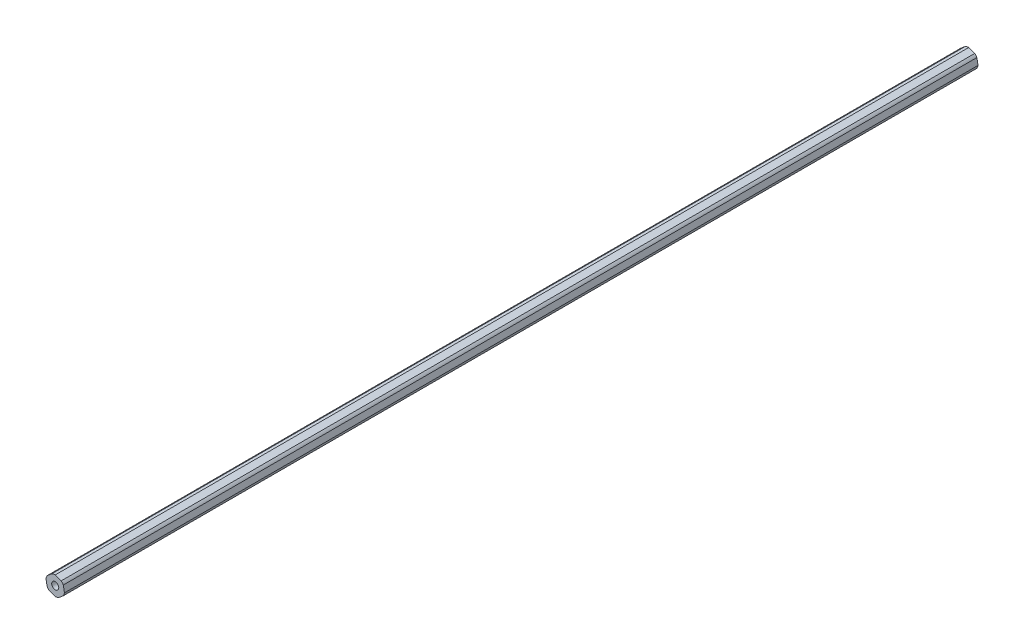
ISO-10303-21;
HEADER;
FILE_DESCRIPTION(('STEP AP214'),'2;1');
FILE_NAME('part.step','',(''),(''),'','','');
FILE_SCHEMA(('AUTOMOTIVE_DESIGN { 1 0 10303 214 1 1 1 1 }'));
ENDSEC;
DATA;
#1=APPLICATION_CONTEXT('core data for automotive mechanical design processes');
#2=APPLICATION_PROTOCOL_DEFINITION('international standard','automotive_design',2000,#1);
#3=PRODUCT_CONTEXT('',#1,'mechanical');
#4=PRODUCT('Part','Part','',(#3));
#5=PRODUCT_RELATED_PRODUCT_CATEGORY('part','',(#4));
#6=PRODUCT_DEFINITION_FORMATION('','',#4);
#7=PRODUCT_DEFINITION_CONTEXT('part definition',#1,'design');
#8=PRODUCT_DEFINITION('design','',#6,#7);
#9=PRODUCT_DEFINITION_SHAPE('','',#8);
#10=(LENGTH_UNIT() NAMED_UNIT(*) SI_UNIT(.MILLI.,.METRE.));
#11=(NAMED_UNIT(*) PLANE_ANGLE_UNIT() SI_UNIT($,.RADIAN.));
#12=(NAMED_UNIT(*) SI_UNIT($,.STERADIAN.) SOLID_ANGLE_UNIT());
#13=UNCERTAINTY_MEASURE_WITH_UNIT(LENGTH_MEASURE(1.E-05),#10,'distance_accuracy_value','');
#14=(GEOMETRIC_REPRESENTATION_CONTEXT(3) GLOBAL_UNCERTAINTY_ASSIGNED_CONTEXT((#13)) GLOBAL_UNIT_ASSIGNED_CONTEXT((#10,
#11,#12)) REPRESENTATION_CONTEXT('',''));
#15=CARTESIAN_POINT('',(0.,0.,0.));
#16=DIRECTION('',(0.,0.,1.));
#17=DIRECTION('',(1.,0.,0.));
#18=AXIS2_PLACEMENT_3D('',#15,#16,#17);
#19=CARTESIAN_POINT('',(0.,0.,658.9014));
#20=DIRECTION('',(0.,0.,-1.));
#21=DIRECTION('',(-1.,0.,0.));
#22=AXIS2_PLACEMENT_3D('',#19,#20,#21);
#23=CYLINDRICAL_SURFACE('',#22,6.75);
#24=CARTESIAN_POINT('',(0.,0.,0.));
#25=DIRECTION('',(0.,0.,1.));
#26=DIRECTION('',(1.,0.,0.));
#27=AXIS2_PLACEMENT_3D('',#24,#25,#26);
#28=CIRCLE('',#27,6.75);
#29=CARTESIAN_POINT('',(0.,6.75,0.));
#30=VERTEX_POINT('',#29);
#31=CARTESIAN_POINT('',(-2.3476328648293,6.32859541541196,0.));
#32=VERTEX_POINT('',#31);
#33=EDGE_CURVE('E176',#30,#32,#28,.T.);
#34=ORIENTED_EDGE('',*,*,#33,.T.);
#35=DIRECTION('',(0.,0.,-1.));
#36=VECTOR('',#35,1.);
#37=CARTESIAN_POINT('',(-2.3476328648293,6.32859541541196,658.9014));
#38=LINE('',#37,#36);
#39=CARTESIAN_POINT('',(-2.3476328648293,6.32859541541196,658.9014));
#40=VERTEX_POINT('',#39);
#41=EDGE_CURVE('E11',#40,#32,#38,.T.);
#42=ORIENTED_EDGE('',*,*,#41,.F.);
#43=CARTESIAN_POINT('',(0.,0.,658.9014));
#44=DIRECTION('',(0.,0.,1.));
#45=DIRECTION('',(1.,0.,0.));
#46=AXIS2_PLACEMENT_3D('',#43,#44,#45);
#47=CIRCLE('',#46,6.75);
#48=CARTESIAN_POINT('',(0.,6.75,658.9014));
#49=VERTEX_POINT('',#48);
#50=EDGE_CURVE('E211',#49,#40,#47,.T.);
#51=ORIENTED_EDGE('',*,*,#50,.F.);
#52=DIRECTION('',(0.,0.,-1.));
#53=VECTOR('',#52,1.);
#54=CARTESIAN_POINT('',(0.,6.75,658.9014));
#55=LINE('',#54,#53);
#56=EDGE_CURVE('E172',#49,#30,#55,.T.);
#57=ORIENTED_EDGE('',*,*,#56,.T.);
#58=EDGE_LOOP('',(#34,#42,#51,#57));
#59=FACE_BOUND('',#58,.T.);
#60=ADVANCED_FACE('F49',(#59),#23,.T.);
#61=CARTESIAN_POINT('',(-2.3476328648293,6.32859541541196,658.9014));
#62=DIRECTION('',(0.645142074045218,-0.7640626311348,0.));
#63=DIRECTION('',(0.7640626311348,0.645142074045218,0.));
#64=AXIS2_PLACEMENT_3D('',#61,#62,#63);
#65=PLANE('',#64);
#66=DIRECTION('',(-0.764062631134801,-0.645142074045218,0.));
#67=VECTOR('',#66,1.);
#68=CARTESIAN_POINT('',(-2.3476328648293,6.32859541541196,0.));
#69=LINE('',#68,#67);
#70=CARTESIAN_POINT('',(-5.84567147554496,3.375,0.));
#71=VERTEX_POINT('',#70);
#72=EDGE_CURVE('E180',#32,#71,#69,.T.);
#73=ORIENTED_EDGE('',*,*,#72,.T.);
#74=DIRECTION('',(0.,0.,-1.));
#75=VECTOR('',#74,1.);
#76=CARTESIAN_POINT('',(-5.84567147554496,3.375,658.9014));
#77=LINE('',#76,#75);
#78=CARTESIAN_POINT('',(-5.84567147554496,3.375,658.9014));
#79=VERTEX_POINT('',#78);
#80=EDGE_CURVE('E59',#79,#71,#77,.T.);
#81=ORIENTED_EDGE('',*,*,#80,.F.);
#82=DIRECTION('',(-0.764062631134801,-0.645142074045218,0.));
#83=VECTOR('',#82,1.);
#84=CARTESIAN_POINT('',(-2.3476328648293,6.32859541541196,658.9014));
#85=LINE('',#84,#83);
#86=EDGE_CURVE('E123',#40,#79,#85,.T.);
#87=ORIENTED_EDGE('',*,*,#86,.F.);
#88=ORIENTED_EDGE('',*,*,#41,.T.);
#89=EDGE_LOOP('',(#73,#81,#87,#88));
#90=FACE_BOUND('',#89,.T.);
#91=ADVANCED_FACE('F311',(#90),#65,.F.);
#92=CARTESIAN_POINT('',(0.,0.,658.9014));
#93=DIRECTION('',(0.,0.,-1.));
#94=DIRECTION('',(-1.,0.,0.));
#95=AXIS2_PLACEMENT_3D('',#92,#93,#94);
#96=CYLINDRICAL_SURFACE('',#95,6.75);
#97=CARTESIAN_POINT('',(0.,0.,0.));
#98=DIRECTION('',(0.,0.,1.));
#99=DIRECTION('',(1.,0.,0.));
#100=AXIS2_PLACEMENT_3D('',#97,#98,#99);
#101=CIRCLE('',#100,6.75);
#102=CARTESIAN_POINT('',(-6.65454083243515,1.13118800800456,0.));
#103=VERTEX_POINT('',#102);
#104=EDGE_CURVE('E184',#71,#103,#101,.T.);
#105=ORIENTED_EDGE('',*,*,#104,.T.);
#106=DIRECTION('',(0.,0.,-1.));
#107=VECTOR('',#106,1.);
#108=CARTESIAN_POINT('',(-6.65454083243515,1.13118800800456,658.9014));
#109=LINE('',#108,#107);
#110=CARTESIAN_POINT('',(-6.65454083243515,1.13118800800456,658.9014));
#111=VERTEX_POINT('',#110);
#112=EDGE_CURVE('E238',#111,#103,#109,.T.);
#113=ORIENTED_EDGE('',*,*,#112,.F.);
#114=CARTESIAN_POINT('',(0.,0.,658.9014));
#115=DIRECTION('',(0.,0.,1.));
#116=DIRECTION('',(1.,0.,0.));
#117=AXIS2_PLACEMENT_3D('',#114,#115,#116);
#118=CIRCLE('',#117,6.75);
#119=EDGE_CURVE('E264',#79,#111,#118,.T.);
#120=ORIENTED_EDGE('',*,*,#119,.F.);
#121=ORIENTED_EDGE('',*,*,#80,.T.);
#122=EDGE_LOOP('',(#105,#113,#120,#121));
#123=FACE_BOUND('',#122,.T.);
#124=ADVANCED_FACE('F315',(#123),#96,.T.);
#125=CARTESIAN_POINT('',(-6.65454083243515,1.13118800800456,658.9014));
#126=DIRECTION('',(0.984268685667725,0.17667810960594,0.));
#127=DIRECTION('',(-0.17667810960594,0.984268685667726,0.));
#128=AXIS2_PLACEMENT_3D('',#125,#126,#127);
#129=PLANE('',#128);
#130=DIRECTION('',(0.17667810960594,-0.984268685667725,0.));
#131=VECTOR('',#130,1.);
#132=CARTESIAN_POINT('',(-6.65454083243515,1.13118800800456,0.));
#133=LINE('',#132,#131);
#134=CARTESIAN_POINT('',(-5.84567147554496,-3.375,0.));
#135=VERTEX_POINT('',#134);
#136=EDGE_CURVE('E187',#103,#135,#133,.T.);
#137=ORIENTED_EDGE('',*,*,#136,.T.);
#138=DIRECTION('',(0.,0.,-1.));
#139=VECTOR('',#138,1.);
#140=CARTESIAN_POINT('',(-5.84567147554496,-3.375,658.9014));
#141=LINE('',#140,#139);
#142=CARTESIAN_POINT('',(-5.84567147554496,-3.375,658.9014));
#143=VERTEX_POINT('',#142);
#144=EDGE_CURVE('E234',#143,#135,#141,.T.);
#145=ORIENTED_EDGE('',*,*,#144,.F.);
#146=DIRECTION('',(0.17667810960594,-0.984268685667725,0.));
#147=VECTOR('',#146,1.);
#148=CARTESIAN_POINT('',(-6.65454083243515,1.13118800800456,658.9014));
#149=LINE('',#148,#147);
#150=EDGE_CURVE('E267',#111,#143,#149,.T.);
#151=ORIENTED_EDGE('',*,*,#150,.F.);
#152=ORIENTED_EDGE('',*,*,#112,.T.);
#153=EDGE_LOOP('',(#137,#145,#151,#152));
#154=FACE_BOUND('',#153,.T.);
#155=ADVANCED_FACE('F319',(#154),#129,.F.);
#156=CARTESIAN_POINT('',(0.,0.,658.9014));
#157=DIRECTION('',(0.,0.,-1.));
#158=DIRECTION('',(-1.,0.,0.));
#159=AXIS2_PLACEMENT_3D('',#156,#157,#158);
#160=CYLINDRICAL_SURFACE('',#159,6.75);
#161=CARTESIAN_POINT('',(0.,0.,0.));
#162=DIRECTION('',(0.,0.,1.));
#163=DIRECTION('',(1.,0.,0.));
#164=AXIS2_PLACEMENT_3D('',#161,#162,#163);
#165=CIRCLE('',#164,6.75);
#166=CARTESIAN_POINT('',(-4.30690796760584,-5.1974074074074,0.));
#167=VERTEX_POINT('',#166);
#168=EDGE_CURVE('E190',#135,#167,#165,.T.);
#169=ORIENTED_EDGE('',*,*,#168,.T.);
#170=DIRECTION('',(0.,0.,-1.));
#171=VECTOR('',#170,1.);
#172=CARTESIAN_POINT('',(-4.30690796760584,-5.1974074074074,658.9014));
#173=LINE('',#172,#171);
#174=CARTESIAN_POINT('',(-4.30690796760584,-5.1974074074074,658.9014));
#175=VERTEX_POINT('',#174);
#176=EDGE_CURVE('E230',#175,#167,#173,.T.);
#177=ORIENTED_EDGE('',*,*,#176,.F.);
#178=CARTESIAN_POINT('',(0.,0.,658.9014));
#179=DIRECTION('',(0.,0.,1.));
#180=DIRECTION('',(1.,0.,0.));
#181=AXIS2_PLACEMENT_3D('',#178,#179,#180);
#182=CIRCLE('',#181,6.75);
#183=EDGE_CURVE('E270',#143,#175,#182,.T.);
#184=ORIENTED_EDGE('',*,*,#183,.F.);
#185=ORIENTED_EDGE('',*,*,#144,.T.);
#186=EDGE_LOOP('',(#169,#177,#184,#185));
#187=FACE_BOUND('',#186,.T.);
#188=ADVANCED_FACE('F325',(#187),#160,.T.);
#189=CARTESIAN_POINT('',(-4.30690796760584,-5.1974074074074,658.9014));
#190=DIRECTION('',(0.339126611622508,0.94074074074074,0.));
#191=DIRECTION('',(-0.94074074074074,0.339126611622508,0.));
#192=AXIS2_PLACEMENT_3D('',#189,#190,#191);
#193=PLANE('',#192);
#194=DIRECTION('',(0.94074074074074,-0.339126611622508,0.));
#195=VECTOR('',#194,1.);
#196=CARTESIAN_POINT('',(-4.30690796760584,-5.1974074074074,0.));
#197=LINE('',#196,#195);
#198=CARTESIAN_POINT('',(0.,-6.75,0.));
#199=VERTEX_POINT('',#198);
#200=EDGE_CURVE('E193',#167,#199,#197,.T.);
#201=ORIENTED_EDGE('',*,*,#200,.T.);
#202=DIRECTION('',(0.,0.,-1.));
#203=VECTOR('',#202,1.);
#204=CARTESIAN_POINT('',(0.,-6.75,658.9014));
#205=LINE('',#204,#203);
#206=CARTESIAN_POINT('',(0.,-6.75,658.9014));
#207=VERTEX_POINT('',#206);
#208=EDGE_CURVE('E226',#207,#199,#205,.T.);
#209=ORIENTED_EDGE('',*,*,#208,.F.);
#210=DIRECTION('',(0.94074074074074,-0.339126611622508,0.));
#211=VECTOR('',#210,1.);
#212=CARTESIAN_POINT('',(-4.30690796760584,-5.1974074074074,658.9014));
#213=LINE('',#212,#211);
#214=EDGE_CURVE('E273',#175,#207,#213,.T.);
#215=ORIENTED_EDGE('',*,*,#214,.F.);
#216=ORIENTED_EDGE('',*,*,#176,.T.);
#217=EDGE_LOOP('',(#201,#209,#215,#216));
#218=FACE_BOUND('',#217,.T.);
#219=ADVANCED_FACE('F329',(#218),#193,.F.);
#220=CARTESIAN_POINT('',(0.,0.,658.9014));
#221=DIRECTION('',(0.,0.,-1.));
#222=DIRECTION('',(-1.,0.,0.));
#223=AXIS2_PLACEMENT_3D('',#220,#221,#222);
#224=CYLINDRICAL_SURFACE('',#223,6.75);
#225=CARTESIAN_POINT('',(0.,0.,0.));
#226=DIRECTION('',(0.,0.,1.));
#227=DIRECTION('',(1.,0.,0.));
#228=AXIS2_PLACEMENT_3D('',#225,#226,#227);
#229=CIRCLE('',#228,6.75);
#230=CARTESIAN_POINT('',(2.3476328648293,-6.32859541541197,0.));
#231=VERTEX_POINT('',#230);
#232=EDGE_CURVE('E196',#199,#231,#229,.T.);
#233=ORIENTED_EDGE('',*,*,#232,.T.);
#234=DIRECTION('',(0.,0.,-1.));
#235=VECTOR('',#234,1.);
#236=CARTESIAN_POINT('',(2.3476328648293,-6.32859541541197,658.9014));
#237=LINE('',#236,#235);
#238=CARTESIAN_POINT('',(2.3476328648293,-6.32859541541197,658.9014));
#239=VERTEX_POINT('',#238);
#240=EDGE_CURVE('E222',#239,#231,#237,.T.);
#241=ORIENTED_EDGE('',*,*,#240,.F.);
#242=CARTESIAN_POINT('',(0.,0.,658.9014));
#243=DIRECTION('',(0.,0.,1.));
#244=DIRECTION('',(1.,0.,0.));
#245=AXIS2_PLACEMENT_3D('',#242,#243,#244);
#246=CIRCLE('',#245,6.75);
#247=EDGE_CURVE('E276',#207,#239,#246,.T.);
#248=ORIENTED_EDGE('',*,*,#247,.F.);
#249=ORIENTED_EDGE('',*,*,#208,.T.);
#250=EDGE_LOOP('',(#233,#241,#248,#249));
#251=FACE_BOUND('',#250,.T.);
#252=ADVANCED_FACE('F333',(#251),#224,.T.);
#253=CARTESIAN_POINT('',(2.34763286482931,-6.32859541541197,658.9014));
#254=DIRECTION('',(-0.645142074045218,0.7640626311348,0.));
#255=DIRECTION('',(-0.7640626311348,-0.645142074045219,0.));
#256=AXIS2_PLACEMENT_3D('',#253,#254,#255);
#257=PLANE('',#256);
#258=DIRECTION('',(0.7640626311348,0.645142074045219,0.));
#259=VECTOR('',#258,1.);
#260=CARTESIAN_POINT('',(2.34763286482931,-6.32859541541197,0.));
#261=LINE('',#260,#259);
#262=CARTESIAN_POINT('',(5.84567147554496,-3.375,0.));
#263=VERTEX_POINT('',#262);
#264=EDGE_CURVE('E199',#231,#263,#261,.T.);
#265=ORIENTED_EDGE('',*,*,#264,.T.);
#266=DIRECTION('',(0.,0.,-1.));
#267=VECTOR('',#266,1.);
#268=CARTESIAN_POINT('',(5.84567147554496,-3.375,658.9014));
#269=LINE('',#268,#267);
#270=CARTESIAN_POINT('',(5.84567147554496,-3.375,658.9014));
#271=VERTEX_POINT('',#270);
#272=EDGE_CURVE('E218',#271,#263,#269,.T.);
#273=ORIENTED_EDGE('',*,*,#272,.F.);
#274=DIRECTION('',(0.7640626311348,0.645142074045219,0.));
#275=VECTOR('',#274,1.);
#276=CARTESIAN_POINT('',(2.34763286482931,-6.32859541541197,658.9014));
#277=LINE('',#276,#275);
#278=EDGE_CURVE('E279',#239,#271,#277,.T.);
#279=ORIENTED_EDGE('',*,*,#278,.F.);
#280=ORIENTED_EDGE('',*,*,#240,.T.);
#281=EDGE_LOOP('',(#265,#273,#279,#280));
#282=FACE_BOUND('',#281,.T.);
#283=ADVANCED_FACE('F287',(#282),#257,.F.);
#284=CARTESIAN_POINT('',(0.,0.,658.9014));
#285=DIRECTION('',(0.,0.,-1.));
#286=DIRECTION('',(-1.,0.,0.));
#287=AXIS2_PLACEMENT_3D('',#284,#285,#286);
#288=CYLINDRICAL_SURFACE('',#287,6.75);
#289=CARTESIAN_POINT('',(0.,0.,0.));
#290=DIRECTION('',(0.,0.,1.));
#291=DIRECTION('',(1.,0.,0.));
#292=AXIS2_PLACEMENT_3D('',#289,#290,#291);
#293=CIRCLE('',#292,6.75);
#294=CARTESIAN_POINT('',(6.65454083243515,-1.13118800800457,0.));
#295=VERTEX_POINT('',#294);
#296=EDGE_CURVE('E202',#263,#295,#293,.T.);
#297=ORIENTED_EDGE('',*,*,#296,.T.);
#298=DIRECTION('',(0.,0.,-1.));
#299=VECTOR('',#298,1.);
#300=CARTESIAN_POINT('',(6.65454083243515,-1.13118800800457,658.9014));
#301=LINE('',#300,#299);
#302=CARTESIAN_POINT('',(6.65454083243515,-1.13118800800457,658.9014));
#303=VERTEX_POINT('',#302);
#304=EDGE_CURVE('E165',#303,#295,#301,.T.);
#305=ORIENTED_EDGE('',*,*,#304,.F.);
#306=CARTESIAN_POINT('',(0.,0.,658.9014));
#307=DIRECTION('',(0.,0.,1.));
#308=DIRECTION('',(1.,0.,0.));
#309=AXIS2_PLACEMENT_3D('',#306,#307,#308);
#310=CIRCLE('',#309,6.75);
#311=EDGE_CURVE('E154',#271,#303,#310,.T.);
#312=ORIENTED_EDGE('',*,*,#311,.F.);
#313=ORIENTED_EDGE('',*,*,#272,.T.);
#314=EDGE_LOOP('',(#297,#305,#312,#313));
#315=FACE_BOUND('',#314,.T.);
#316=ADVANCED_FACE('F291',(#315),#288,.T.);
#317=CARTESIAN_POINT('',(6.65454083243515,-1.13118800800457,658.9014));
#318=DIRECTION('',(-0.984268685667725,-0.17667810960594,0.));
#319=DIRECTION('',(0.17667810960594,-0.984268685667725,0.));
#320=AXIS2_PLACEMENT_3D('',#317,#318,#319);
#321=PLANE('',#320);
#322=DIRECTION('',(-0.17667810960594,0.984268685667725,0.));
#323=VECTOR('',#322,1.);
#324=CARTESIAN_POINT('',(6.65454083243515,-1.13118800800457,0.));
#325=LINE('',#324,#323);
#326=CARTESIAN_POINT('',(5.84567147554496,3.375,0.));
#327=VERTEX_POINT('',#326);
#328=EDGE_CURVE('E163',#295,#327,#325,.T.);
#329=ORIENTED_EDGE('',*,*,#328,.T.);
#330=DIRECTION('',(0.,0.,-1.));
#331=VECTOR('',#330,1.);
#332=CARTESIAN_POINT('',(5.84567147554496,3.375,658.9014));
#333=LINE('',#332,#331);
#334=CARTESIAN_POINT('',(5.84567147554496,3.375,658.9014));
#335=VERTEX_POINT('',#334);
#336=EDGE_CURVE('E160',#335,#327,#333,.T.);
#337=ORIENTED_EDGE('',*,*,#336,.F.);
#338=DIRECTION('',(-0.17667810960594,0.984268685667725,0.));
#339=VECTOR('',#338,1.);
#340=CARTESIAN_POINT('',(6.65454083243515,-1.13118800800457,658.9014));
#341=LINE('',#340,#339);
#342=EDGE_CURVE('E148',#303,#335,#341,.T.);
#343=ORIENTED_EDGE('',*,*,#342,.F.);
#344=ORIENTED_EDGE('',*,*,#304,.T.);
#345=EDGE_LOOP('',(#329,#337,#343,#344));
#346=FACE_BOUND('',#345,.T.);
#347=ADVANCED_FACE('F161',(#346),#321,.F.);
#348=CARTESIAN_POINT('',(0.,0.,658.9014));
#349=DIRECTION('',(0.,0.,-1.));
#350=DIRECTION('',(-1.,0.,0.));
#351=AXIS2_PLACEMENT_3D('',#348,#349,#350);
#352=CYLINDRICAL_SURFACE('',#351,6.75);
#353=CARTESIAN_POINT('',(0.,0.,0.));
#354=DIRECTION('',(0.,0.,1.));
#355=DIRECTION('',(1.,0.,0.));
#356=AXIS2_PLACEMENT_3D('',#353,#354,#355);
#357=CIRCLE('',#356,6.75);
#358=CARTESIAN_POINT('',(4.30690796760584,5.1974074074074,0.));
#359=VERTEX_POINT('',#358);
#360=EDGE_CURVE('E109',#327,#359,#357,.T.);
#361=ORIENTED_EDGE('',*,*,#360,.T.);
#362=DIRECTION('',(0.,0.,-1.));
#363=VECTOR('',#362,1.);
#364=CARTESIAN_POINT('',(4.30690796760584,5.1974074074074,658.9014));
#365=LINE('',#364,#363);
#366=CARTESIAN_POINT('',(4.30690796760584,5.1974074074074,658.9014));
#367=VERTEX_POINT('',#366);
#368=EDGE_CURVE('E166',#367,#359,#365,.T.);
#369=ORIENTED_EDGE('',*,*,#368,.F.);
#370=CARTESIAN_POINT('',(0.,0.,658.9014));
#371=DIRECTION('',(0.,0.,1.));
#372=DIRECTION('',(1.,0.,0.));
#373=AXIS2_PLACEMENT_3D('',#370,#371,#372);
#374=CIRCLE('',#373,6.75);
#375=EDGE_CURVE('E152',#335,#367,#374,.T.);
#376=ORIENTED_EDGE('',*,*,#375,.F.);
#377=ORIENTED_EDGE('',*,*,#336,.T.);
#378=EDGE_LOOP('',(#361,#369,#376,#377));
#379=FACE_BOUND('',#378,.T.);
#380=ADVANCED_FACE('F168',(#379),#352,.T.);
#381=CARTESIAN_POINT('',(4.30690796760584,5.1974074074074,658.9014));
#382=DIRECTION('',(-0.339126611622507,-0.940740740740741,0.));
#383=DIRECTION('',(0.940740740740741,-0.339126611622507,0.));
#384=AXIS2_PLACEMENT_3D('',#381,#382,#383);
#385=PLANE('',#384);
#386=DIRECTION('',(-0.940740740740741,0.339126611622507,0.));
#387=VECTOR('',#386,1.);
#388=CARTESIAN_POINT('',(4.30690796760584,5.1974074074074,0.));
#389=LINE('',#388,#387);
#390=EDGE_CURVE('E115',#359,#30,#389,.T.);
#391=ORIENTED_EDGE('',*,*,#390,.T.);
#392=ORIENTED_EDGE('',*,*,#56,.F.);
#393=DIRECTION('',(-0.940740740740741,0.339126611622507,0.));
#394=VECTOR('',#393,1.);
#395=CARTESIAN_POINT('',(4.30690796760584,5.1974074074074,658.9014));
#396=LINE('',#395,#394);
#397=EDGE_CURVE('E68',#367,#49,#396,.T.);
#398=ORIENTED_EDGE('',*,*,#397,.F.);
#399=ORIENTED_EDGE('',*,*,#368,.T.);
#400=EDGE_LOOP('',(#391,#392,#398,#399));
#401=FACE_BOUND('',#400,.T.);
#402=ADVANCED_FACE('F299',(#401),#385,.F.);
#403=CARTESIAN_POINT('',(0.,0.,658.9014));
#404=DIRECTION('',(0.,0.,1.));
#405=DIRECTION('',(1.,0.,0.));
#406=AXIS2_PLACEMENT_3D('',#403,#404,#405);
#407=PLANE('',#406);
#408=CARTESIAN_POINT('',(0.,0.,658.9014));
#409=DIRECTION('',(0.,0.,1.));
#410=DIRECTION('',(1.,0.,0.));
#411=AXIS2_PLACEMENT_3D('',#408,#409,#410);
#412=CIRCLE('',#411,2.55269999999999);
#413=CARTESIAN_POINT('',(2.55269999999999,0.,658.9014));
#414=VERTEX_POINT('',#413);
#415=EDGE_CURVE('E251',#414,#414,#412,.T.);
#416=ORIENTED_EDGE('',*,*,#415,.F.);
#417=EDGE_LOOP('',(#416));
#418=FACE_BOUND('',#417,.T.);
#419=ORIENTED_EDGE('',*,*,#50,.T.);
#420=ORIENTED_EDGE('',*,*,#86,.T.);
#421=ORIENTED_EDGE('',*,*,#119,.T.);
#422=ORIENTED_EDGE('',*,*,#150,.T.);
#423=ORIENTED_EDGE('',*,*,#183,.T.);
#424=ORIENTED_EDGE('',*,*,#214,.T.);
#425=ORIENTED_EDGE('',*,*,#247,.T.);
#426=ORIENTED_EDGE('',*,*,#278,.T.);
#427=ORIENTED_EDGE('',*,*,#311,.T.);
#428=ORIENTED_EDGE('',*,*,#342,.T.);
#429=ORIENTED_EDGE('',*,*,#375,.T.);
#430=ORIENTED_EDGE('',*,*,#397,.T.);
#431=EDGE_LOOP('',(#419,#420,#421,#422,#423,#424,#425,#426,#427,#428,#429,#430));
#432=FACE_BOUND('',#431,.T.);
#433=ADVANCED_FACE('F150',(#418,#432),#407,.T.);
#434=CARTESIAN_POINT('',(0.,0.,0.));
#435=DIRECTION('',(0.,0.,1.));
#436=DIRECTION('',(1.,0.,0.));
#437=AXIS2_PLACEMENT_3D('',#434,#435,#436);
#438=PLANE('',#437);
#439=CARTESIAN_POINT('',(0.,0.,0.));
#440=DIRECTION('',(0.,0.,-1.));
#441=DIRECTION('',(-1.,0.,0.));
#442=AXIS2_PLACEMENT_3D('',#439,#440,#441);
#443=CIRCLE('',#442,2.55269999999999);
#444=CARTESIAN_POINT('',(-2.55269999999999,0.,0.));
#445=VERTEX_POINT('',#444);
#446=EDGE_CURVE('E538',#445,#445,#443,.T.);
#447=ORIENTED_EDGE('',*,*,#446,.F.);
#448=EDGE_LOOP('',(#447));
#449=FACE_BOUND('',#448,.T.);
#450=ORIENTED_EDGE('',*,*,#33,.F.);
#451=ORIENTED_EDGE('',*,*,#390,.F.);
#452=ORIENTED_EDGE('',*,*,#360,.F.);
#453=ORIENTED_EDGE('',*,*,#328,.F.);
#454=ORIENTED_EDGE('',*,*,#296,.F.);
#455=ORIENTED_EDGE('',*,*,#264,.F.);
#456=ORIENTED_EDGE('',*,*,#232,.F.);
#457=ORIENTED_EDGE('',*,*,#200,.F.);
#458=ORIENTED_EDGE('',*,*,#168,.F.);
#459=ORIENTED_EDGE('',*,*,#136,.F.);
#460=ORIENTED_EDGE('',*,*,#104,.F.);
#461=ORIENTED_EDGE('',*,*,#72,.F.);
#462=EDGE_LOOP('',(#450,#451,#452,#453,#454,#455,#456,#457,#458,#459,#460,#461));
#463=FACE_BOUND('',#462,.T.);
#464=ADVANCED_FACE('F294',(#449,#463),#438,.F.);
#465=CARTESIAN_POINT('',(0.,0.,0.));
#466=DIRECTION('',(0.,0.,1.));
#467=DIRECTION('',(1.,0.,0.));
#468=AXIS2_PLACEMENT_3D('',#465,#466,#467);
#469=CYLINDRICAL_SURFACE('',#468,2.0193);
#470=CARTESIAN_POINT('',(0.,0.,19.3704990541893));
#471=DIRECTION('',(0.,0.,-1.));
#472=DIRECTION('',(-1.,0.,0.));
#473=AXIS2_PLACEMENT_3D('',#470,#471,#472);
#474=CIRCLE('',#473,2.0193);
#475=CARTESIAN_POINT('',(-2.0193,0.,19.3704990541893));
#476=VERTEX_POINT('',#475);
#477=EDGE_CURVE('E52',#476,#476,#474,.T.);
#478=ORIENTED_EDGE('',*,*,#477,.T.);
#479=EDGE_LOOP('',(#478));
#480=FACE_BOUND('',#479,.T.);
#481=CARTESIAN_POINT('',(0.,0.,639.530900945811));
#482=DIRECTION('',(0.,0.,1.));
#483=DIRECTION('',(1.,0.,0.));
#484=AXIS2_PLACEMENT_3D('',#481,#482,#483);
#485=CIRCLE('',#484,2.0193);
#486=CARTESIAN_POINT('',(2.0193,0.,639.530900945811));
#487=VERTEX_POINT('',#486);
#488=EDGE_CURVE('E181',#487,#487,#485,.T.);
#489=ORIENTED_EDGE('',*,*,#488,.T.);
#490=EDGE_LOOP('',(#489));
#491=FACE_BOUND('',#490,.T.);
#492=ADVANCED_FACE('F379',(#480,#491),#469,.F.);
#493=CARTESIAN_POINT('',(0.,0.,639.8514));
#494=DIRECTION('',(0.,0.,1.));
#495=DIRECTION('',(1.,0.,0.));
#496=AXIS2_PLACEMENT_3D('',#493,#494,#495);
#497=CONICAL_SURFACE('',#496,2.55269999999999,1.02974425867664);
#498=CARTESIAN_POINT('',(0.,0.,639.8514));
#499=DIRECTION('',(0.,0.,1.));
#500=DIRECTION('',(1.,0.,0.));
#501=AXIS2_PLACEMENT_3D('',#498,#499,#500);
#502=CIRCLE('',#501,2.55269999999999);
#503=CARTESIAN_POINT('',(2.55269999999999,0.,639.8514));
#504=VERTEX_POINT('',#503);
#505=EDGE_CURVE('E246',#504,#504,#502,.T.);
#506=ORIENTED_EDGE('',*,*,#505,.T.);
#507=EDGE_LOOP('',(#506));
#508=FACE_BOUND('',#507,.T.);
#509=ORIENTED_EDGE('',*,*,#488,.F.);
#510=EDGE_LOOP('',(#509));
#511=FACE_BOUND('',#510,.T.);
#512=ADVANCED_FACE('F373',(#508,#511),#497,.F.);
#513=CARTESIAN_POINT('',(0.,0.,658.9014));
#514=DIRECTION('',(0.,0.,1.));
#515=DIRECTION('',(1.,0.,0.));
#516=AXIS2_PLACEMENT_3D('',#513,#514,#515);
#517=CYLINDRICAL_SURFACE('',#516,2.55269999999999);
#518=ORIENTED_EDGE('',*,*,#505,.F.);
#519=EDGE_LOOP('',(#518));
#520=FACE_BOUND('',#519,.T.);
#521=ORIENTED_EDGE('',*,*,#415,.T.);
#522=EDGE_LOOP('',(#521));
#523=FACE_BOUND('',#522,.T.);
#524=ADVANCED_FACE('F378',(#520,#523),#517,.F.);
#525=CARTESIAN_POINT('',(0.,0.,19.05));
#526=DIRECTION('',(0.,0.,-1.));
#527=DIRECTION('',(-1.,0.,0.));
#528=AXIS2_PLACEMENT_3D('',#525,#526,#527);
#529=CONICAL_SURFACE('',#528,2.55269999999999,1.02974425867665);
#530=CARTESIAN_POINT('',(0.,0.,19.05));
#531=DIRECTION('',(0.,0.,-1.));
#532=DIRECTION('',(-1.,0.,0.));
#533=AXIS2_PLACEMENT_3D('',#530,#531,#532);
#534=CIRCLE('',#533,2.55269999999999);
#535=CARTESIAN_POINT('',(-2.55269999999999,0.,19.05));
#536=VERTEX_POINT('',#535);
#537=EDGE_CURVE('E535',#536,#536,#534,.T.);
#538=ORIENTED_EDGE('',*,*,#537,.T.);
#539=EDGE_LOOP('',(#538));
#540=FACE_BOUND('',#539,.T.);
#541=ORIENTED_EDGE('',*,*,#477,.F.);
#542=EDGE_LOOP('',(#541));
#543=FACE_BOUND('',#542,.T.);
#544=ADVANCED_FACE('F392',(#540,#543),#529,.F.);
#545=CARTESIAN_POINT('',(0.,0.,0.));
#546=DIRECTION('',(0.,0.,-1.));
#547=DIRECTION('',(-1.,0.,0.));
#548=AXIS2_PLACEMENT_3D('',#545,#546,#547);
#549=CYLINDRICAL_SURFACE('',#548,2.55269999999999);
#550=ORIENTED_EDGE('',*,*,#537,.F.);
#551=EDGE_LOOP('',(#550));
#552=FACE_BOUND('',#551,.T.);
#553=ORIENTED_EDGE('',*,*,#446,.T.);
#554=EDGE_LOOP('',(#553));
#555=FACE_BOUND('',#554,.T.);
#556=ADVANCED_FACE('F424',(#552,#555),#549,.F.);
#557=CLOSED_SHELL('',(#60,#91,#124,#155,#188,#219,#252,#283,#316,#347,#380,#402,#433,#464,#492,
#512,#524,#544,#556));
#558=MANIFOLD_SOLID_BREP('B2',#557);
#559=ADVANCED_BREP_SHAPE_REPRESENTATION('',(#18,#558),#14);
#560=SHAPE_DEFINITION_REPRESENTATION(#9,#559);
ENDSEC;
END-ISO-10303-21;
